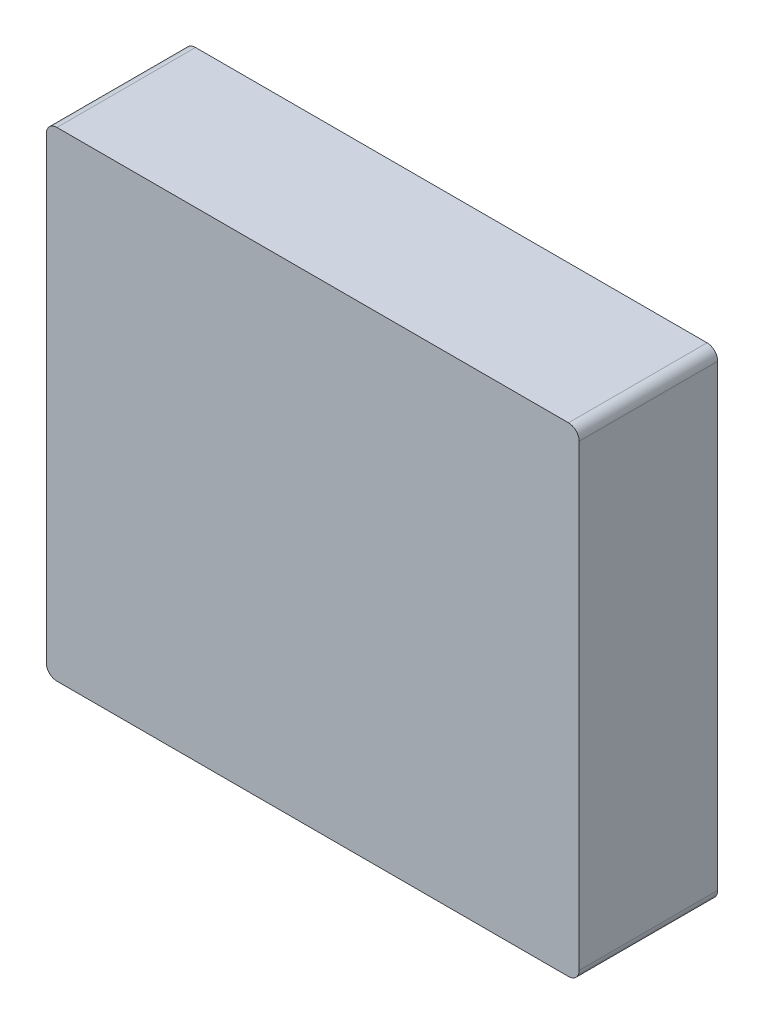
ISO-10303-21;
HEADER;
FILE_DESCRIPTION(('STEP AP214'),'2;1');
FILE_NAME('part.step','',(''),(''),'','','');
FILE_SCHEMA(('AUTOMOTIVE_DESIGN { 1 0 10303 214 1 1 1 1 }'));
ENDSEC;
DATA;
#1=APPLICATION_CONTEXT('core data for automotive mechanical design processes');
#2=APPLICATION_PROTOCOL_DEFINITION('international standard','automotive_design',2000,#1);
#3=PRODUCT_CONTEXT('',#1,'mechanical');
#4=PRODUCT('Part','Part','',(#3));
#5=PRODUCT_RELATED_PRODUCT_CATEGORY('part','',(#4));
#6=PRODUCT_DEFINITION_FORMATION('','',#4);
#7=PRODUCT_DEFINITION_CONTEXT('part definition',#1,'design');
#8=PRODUCT_DEFINITION('design','',#6,#7);
#9=PRODUCT_DEFINITION_SHAPE('','',#8);
#10=(LENGTH_UNIT() NAMED_UNIT(*) SI_UNIT(.MILLI.,.METRE.));
#11=(NAMED_UNIT(*) PLANE_ANGLE_UNIT() SI_UNIT($,.RADIAN.));
#12=(NAMED_UNIT(*) SI_UNIT($,.STERADIAN.) SOLID_ANGLE_UNIT());
#13=UNCERTAINTY_MEASURE_WITH_UNIT(LENGTH_MEASURE(1.E-05),#10,'distance_accuracy_value','');
#14=(GEOMETRIC_REPRESENTATION_CONTEXT(3) GLOBAL_UNCERTAINTY_ASSIGNED_CONTEXT((#13)) GLOBAL_UNIT_ASSIGNED_CONTEXT((#10,
#11,#12)) REPRESENTATION_CONTEXT('',''));
#15=CARTESIAN_POINT('',(0.,0.,0.));
#16=DIRECTION('',(0.,0.,1.));
#17=DIRECTION('',(1.,0.,0.));
#18=AXIS2_PLACEMENT_3D('',#15,#16,#17);
#19=CARTESIAN_POINT('',(-48.,-43.,26.));
#20=DIRECTION('',(0.,0.,-1.));
#21=DIRECTION('',(-1.,0.,0.));
#22=AXIS2_PLACEMENT_3D('',#19,#20,#21);
#23=CYLINDRICAL_SURFACE('',#22,2.);
#24=CARTESIAN_POINT('',(-48.,-43.,0.));
#25=DIRECTION('',(0.,0.,1.));
#26=DIRECTION('',(1.,0.,0.));
#27=AXIS2_PLACEMENT_3D('',#24,#25,#26);
#28=CIRCLE('',#27,2.);
#29=CARTESIAN_POINT('',(-50.,-43.,0.));
#30=VERTEX_POINT('',#29);
#31=CARTESIAN_POINT('',(-48.,-45.,0.));
#32=VERTEX_POINT('',#31);
#33=EDGE_CURVE('E173',#30,#32,#28,.T.);
#34=ORIENTED_EDGE('',*,*,#33,.T.);
#35=DIRECTION('',(0.,0.,-1.));
#36=VECTOR('',#35,1.);
#37=CARTESIAN_POINT('',(-48.,-45.,26.));
#38=LINE('',#37,#36);
#39=CARTESIAN_POINT('',(-48.,-45.,26.));
#40=VERTEX_POINT('',#39);
#41=EDGE_CURVE('E154',#40,#32,#38,.T.);
#42=ORIENTED_EDGE('',*,*,#41,.F.);
#43=CARTESIAN_POINT('',(-48.,-43.,26.));
#44=DIRECTION('',(0.,0.,1.));
#45=DIRECTION('',(1.,0.,0.));
#46=AXIS2_PLACEMENT_3D('',#43,#44,#45);
#47=CIRCLE('',#46,2.);
#48=CARTESIAN_POINT('',(-50.,-43.,26.));
#49=VERTEX_POINT('',#48);
#50=EDGE_CURVE('E161',#49,#40,#47,.T.);
#51=ORIENTED_EDGE('',*,*,#50,.F.);
#52=DIRECTION('',(0.,0.,-1.));
#53=VECTOR('',#52,1.);
#54=CARTESIAN_POINT('',(-50.,-43.,26.));
#55=LINE('',#54,#53);
#56=EDGE_CURVE('E275',#49,#30,#55,.T.);
#57=ORIENTED_EDGE('',*,*,#56,.T.);
#58=EDGE_LOOP('',(#34,#42,#51,#57));
#59=FACE_BOUND('',#58,.T.);
#60=ADVANCED_FACE('F34',(#59),#23,.T.);
#61=CARTESIAN_POINT('',(-48.,-45.,26.));
#62=DIRECTION('',(0.,1.,0.));
#63=DIRECTION('',(-1.,0.,0.));
#64=AXIS2_PLACEMENT_3D('',#61,#62,#63);
#65=PLANE('',#64);
#66=DIRECTION('',(1.,0.,0.));
#67=VECTOR('',#66,1.);
#68=CARTESIAN_POINT('',(-48.,-45.,0.));
#69=LINE('',#68,#67);
#70=CARTESIAN_POINT('',(48.,-45.,0.));
#71=VERTEX_POINT('',#70);
#72=EDGE_CURVE('E259',#32,#71,#69,.T.);
#73=ORIENTED_EDGE('',*,*,#72,.T.);
#74=DIRECTION('',(0.,0.,-1.));
#75=VECTOR('',#74,1.);
#76=CARTESIAN_POINT('',(48.,-45.,26.));
#77=LINE('',#76,#75);
#78=CARTESIAN_POINT('',(48.,-45.,26.));
#79=VERTEX_POINT('',#78);
#80=EDGE_CURVE('E157',#79,#71,#77,.T.);
#81=ORIENTED_EDGE('',*,*,#80,.F.);
#82=DIRECTION('',(1.,0.,0.));
#83=VECTOR('',#82,1.);
#84=CARTESIAN_POINT('',(-48.,-45.,26.));
#85=LINE('',#84,#83);
#86=EDGE_CURVE('E150',#40,#79,#85,.T.);
#87=ORIENTED_EDGE('',*,*,#86,.F.);
#88=ORIENTED_EDGE('',*,*,#41,.T.);
#89=EDGE_LOOP('',(#73,#81,#87,#88));
#90=FACE_BOUND('',#89,.T.);
#91=ADVANCED_FACE('F152',(#90),#65,.F.);
#92=CARTESIAN_POINT('',(48.,-43.,26.));
#93=DIRECTION('',(0.,0.,-1.));
#94=DIRECTION('',(-1.,0.,0.));
#95=AXIS2_PLACEMENT_3D('',#92,#93,#94);
#96=CYLINDRICAL_SURFACE('',#95,2.);
#97=CARTESIAN_POINT('',(48.,-43.,0.));
#98=DIRECTION('',(0.,0.,1.));
#99=DIRECTION('',(1.,0.,0.));
#100=AXIS2_PLACEMENT_3D('',#97,#98,#99);
#101=CIRCLE('',#100,2.);
#102=CARTESIAN_POINT('',(50.,-43.,0.));
#103=VERTEX_POINT('',#102);
#104=EDGE_CURVE('E278',#71,#103,#101,.T.);
#105=ORIENTED_EDGE('',*,*,#104,.T.);
#106=DIRECTION('',(0.,0.,-1.));
#107=VECTOR('',#106,1.);
#108=CARTESIAN_POINT('',(50.,-43.,26.));
#109=LINE('',#108,#107);
#110=CARTESIAN_POINT('',(50.,-43.,26.));
#111=VERTEX_POINT('',#110);
#112=EDGE_CURVE('E178',#111,#103,#109,.T.);
#113=ORIENTED_EDGE('',*,*,#112,.F.);
#114=CARTESIAN_POINT('',(48.,-43.,26.));
#115=DIRECTION('',(0.,0.,1.));
#116=DIRECTION('',(1.,0.,0.));
#117=AXIS2_PLACEMENT_3D('',#114,#115,#116);
#118=CIRCLE('',#117,2.);
#119=EDGE_CURVE('E160',#79,#111,#118,.T.);
#120=ORIENTED_EDGE('',*,*,#119,.F.);
#121=ORIENTED_EDGE('',*,*,#80,.T.);
#122=EDGE_LOOP('',(#105,#113,#120,#121));
#123=FACE_BOUND('',#122,.T.);
#124=ADVANCED_FACE('F323',(#123),#96,.T.);
#125=CARTESIAN_POINT('',(50.,-43.,26.));
#126=DIRECTION('',(-1.,0.,0.));
#127=DIRECTION('',(0.,-1.,0.));
#128=AXIS2_PLACEMENT_3D('',#125,#126,#127);
#129=PLANE('',#128);
#130=DIRECTION('',(0.,1.,0.));
#131=VECTOR('',#130,1.);
#132=CARTESIAN_POINT('',(50.,-43.,0.));
#133=LINE('',#132,#131);
#134=CARTESIAN_POINT('',(50.,43.,0.));
#135=VERTEX_POINT('',#134);
#136=EDGE_CURVE('E280',#103,#135,#133,.T.);
#137=ORIENTED_EDGE('',*,*,#136,.T.);
#138=DIRECTION('',(0.,0.,-1.));
#139=VECTOR('',#138,1.);
#140=CARTESIAN_POINT('',(50.,43.,26.));
#141=LINE('',#140,#139);
#142=CARTESIAN_POINT('',(50.,43.,26.));
#143=VERTEX_POINT('',#142);
#144=EDGE_CURVE('E299',#143,#135,#141,.T.);
#145=ORIENTED_EDGE('',*,*,#144,.F.);
#146=DIRECTION('',(0.,1.,0.));
#147=VECTOR('',#146,1.);
#148=CARTESIAN_POINT('',(50.,-43.,26.));
#149=LINE('',#148,#147);
#150=EDGE_CURVE('E267',#111,#143,#149,.T.);
#151=ORIENTED_EDGE('',*,*,#150,.F.);
#152=ORIENTED_EDGE('',*,*,#112,.T.);
#153=EDGE_LOOP('',(#137,#145,#151,#152));
#154=FACE_BOUND('',#153,.T.);
#155=ADVANCED_FACE('F306',(#154),#129,.F.);
#156=CARTESIAN_POINT('',(48.,43.,26.));
#157=DIRECTION('',(0.,0.,-1.));
#158=DIRECTION('',(-1.,0.,0.));
#159=AXIS2_PLACEMENT_3D('',#156,#157,#158);
#160=CYLINDRICAL_SURFACE('',#159,2.);
#161=CARTESIAN_POINT('',(48.,43.,0.));
#162=DIRECTION('',(0.,0.,1.));
#163=DIRECTION('',(1.,0.,0.));
#164=AXIS2_PLACEMENT_3D('',#161,#162,#163);
#165=CIRCLE('',#164,2.);
#166=CARTESIAN_POINT('',(48.,45.,0.));
#167=VERTEX_POINT('',#166);
#168=EDGE_CURVE('E282',#135,#167,#165,.T.);
#169=ORIENTED_EDGE('',*,*,#168,.T.);
#170=DIRECTION('',(0.,0.,-1.));
#171=VECTOR('',#170,1.);
#172=CARTESIAN_POINT('',(48.,45.,26.));
#173=LINE('',#172,#171);
#174=CARTESIAN_POINT('',(48.,45.,26.));
#175=VERTEX_POINT('',#174);
#176=EDGE_CURVE('E296',#175,#167,#173,.T.);
#177=ORIENTED_EDGE('',*,*,#176,.F.);
#178=CARTESIAN_POINT('',(48.,43.,26.));
#179=DIRECTION('',(0.,0.,1.));
#180=DIRECTION('',(1.,0.,0.));
#181=AXIS2_PLACEMENT_3D('',#178,#179,#180);
#182=CIRCLE('',#181,2.);
#183=EDGE_CURVE('E269',#143,#175,#182,.T.);
#184=ORIENTED_EDGE('',*,*,#183,.F.);
#185=ORIENTED_EDGE('',*,*,#144,.T.);
#186=EDGE_LOOP('',(#169,#177,#184,#185));
#187=FACE_BOUND('',#186,.T.);
#188=ADVANCED_FACE('F315',(#187),#160,.T.);
#189=CARTESIAN_POINT('',(48.,45.,26.));
#190=DIRECTION('',(0.,-1.,0.));
#191=DIRECTION('',(1.,0.,0.));
#192=AXIS2_PLACEMENT_3D('',#189,#190,#191);
#193=PLANE('',#192);
#194=DIRECTION('',(-1.,0.,0.));
#195=VECTOR('',#194,1.);
#196=CARTESIAN_POINT('',(48.,45.,0.));
#197=LINE('',#196,#195);
#198=CARTESIAN_POINT('',(-48.,45.,0.));
#199=VERTEX_POINT('',#198);
#200=EDGE_CURVE('E284',#167,#199,#197,.T.);
#201=ORIENTED_EDGE('',*,*,#200,.T.);
#202=DIRECTION('',(0.,0.,-1.));
#203=VECTOR('',#202,1.);
#204=CARTESIAN_POINT('',(-48.,45.,26.));
#205=LINE('',#204,#203);
#206=CARTESIAN_POINT('',(-48.,45.,26.));
#207=VERTEX_POINT('',#206);
#208=EDGE_CURVE('E293',#207,#199,#205,.T.);
#209=ORIENTED_EDGE('',*,*,#208,.F.);
#210=DIRECTION('',(-1.,0.,0.));
#211=VECTOR('',#210,1.);
#212=CARTESIAN_POINT('',(48.,45.,26.));
#213=LINE('',#212,#211);
#214=EDGE_CURVE('E271',#175,#207,#213,.T.);
#215=ORIENTED_EDGE('',*,*,#214,.F.);
#216=ORIENTED_EDGE('',*,*,#176,.T.);
#217=EDGE_LOOP('',(#201,#209,#215,#216));
#218=FACE_BOUND('',#217,.T.);
#219=ADVANCED_FACE('F319',(#218),#193,.F.);
#220=CARTESIAN_POINT('',(-48.,43.,26.));
#221=DIRECTION('',(0.,0.,-1.));
#222=DIRECTION('',(-1.,0.,0.));
#223=AXIS2_PLACEMENT_3D('',#220,#221,#222);
#224=CYLINDRICAL_SURFACE('',#223,2.);
#225=CARTESIAN_POINT('',(-48.,43.,0.));
#226=DIRECTION('',(0.,0.,1.));
#227=DIRECTION('',(1.,0.,0.));
#228=AXIS2_PLACEMENT_3D('',#225,#226,#227);
#229=CIRCLE('',#228,2.);
#230=CARTESIAN_POINT('',(-50.,43.,0.));
#231=VERTEX_POINT('',#230);
#232=EDGE_CURVE('E286',#199,#231,#229,.T.);
#233=ORIENTED_EDGE('',*,*,#232,.T.);
#234=DIRECTION('',(0.,0.,-1.));
#235=VECTOR('',#234,1.);
#236=CARTESIAN_POINT('',(-50.,43.,26.));
#237=LINE('',#236,#235);
#238=CARTESIAN_POINT('',(-50.,43.,26.));
#239=VERTEX_POINT('',#238);
#240=EDGE_CURVE('E290',#239,#231,#237,.T.);
#241=ORIENTED_EDGE('',*,*,#240,.F.);
#242=CARTESIAN_POINT('',(-48.,43.,26.));
#243=DIRECTION('',(0.,0.,1.));
#244=DIRECTION('',(1.,0.,0.));
#245=AXIS2_PLACEMENT_3D('',#242,#243,#244);
#246=CIRCLE('',#245,2.);
#247=EDGE_CURVE('E273',#207,#239,#246,.T.);
#248=ORIENTED_EDGE('',*,*,#247,.F.);
#249=ORIENTED_EDGE('',*,*,#208,.T.);
#250=EDGE_LOOP('',(#233,#241,#248,#249));
#251=FACE_BOUND('',#250,.T.);
#252=ADVANCED_FACE('F443',(#251),#224,.T.);
#253=CARTESIAN_POINT('',(-50.,43.,26.));
#254=DIRECTION('',(1.,0.,0.));
#255=DIRECTION('',(0.,1.,0.));
#256=AXIS2_PLACEMENT_3D('',#253,#254,#255);
#257=PLANE('',#256);
#258=DIRECTION('',(0.,-1.,0.));
#259=VECTOR('',#258,1.);
#260=CARTESIAN_POINT('',(-50.,43.,0.));
#261=LINE('',#260,#259);
#262=EDGE_CURVE('E170',#231,#30,#261,.T.);
#263=ORIENTED_EDGE('',*,*,#262,.T.);
#264=ORIENTED_EDGE('',*,*,#56,.F.);
#265=DIRECTION('',(0.,-1.,0.));
#266=VECTOR('',#265,1.);
#267=CARTESIAN_POINT('',(-50.,43.,26.));
#268=LINE('',#267,#266);
#269=EDGE_CURVE('E166',#239,#49,#268,.T.);
#270=ORIENTED_EDGE('',*,*,#269,.F.);
#271=ORIENTED_EDGE('',*,*,#240,.T.);
#272=EDGE_LOOP('',(#263,#264,#270,#271));
#273=FACE_BOUND('',#272,.T.);
#274=ADVANCED_FACE('F437',(#273),#257,.F.);
#275=CARTESIAN_POINT('',(-48.,-43.,26.));
#276=DIRECTION('',(0.,0.,1.));
#277=DIRECTION('',(1.,0.,0.));
#278=AXIS2_PLACEMENT_3D('',#275,#276,#277);
#279=PLANE('',#278);
#280=ORIENTED_EDGE('',*,*,#50,.T.);
#281=ORIENTED_EDGE('',*,*,#86,.T.);
#282=ORIENTED_EDGE('',*,*,#119,.T.);
#283=ORIENTED_EDGE('',*,*,#150,.T.);
#284=ORIENTED_EDGE('',*,*,#183,.T.);
#285=ORIENTED_EDGE('',*,*,#214,.T.);
#286=ORIENTED_EDGE('',*,*,#247,.T.);
#287=ORIENTED_EDGE('',*,*,#269,.T.);
#288=EDGE_LOOP('',(#280,#281,#282,#283,#284,#285,#286,#287));
#289=FACE_BOUND('',#288,.T.);
#290=ADVANCED_FACE('F164',(#289),#279,.T.);
#291=CARTESIAN_POINT('',(-48.,-43.,0.));
#292=DIRECTION('',(0.,0.,1.));
#293=DIRECTION('',(1.,0.,0.));
#294=AXIS2_PLACEMENT_3D('',#291,#292,#293);
#295=PLANE('',#294);
#296=DIRECTION('',(0.,-1.,0.));
#297=VECTOR('',#296,1.);
#298=CARTESIAN_POINT('',(48.5,-43.,0.));
#299=LINE('',#298,#297);
#300=CARTESIAN_POINT('',(48.5,-43.5,0.));
#301=VERTEX_POINT('',#300);
#302=CARTESIAN_POINT('',(48.5,43.5,0.));
#303=VERTEX_POINT('',#302);
#304=EDGE_CURVE('E215',#301,#303,#299,.F.);
#305=ORIENTED_EDGE('',*,*,#304,.T.);
#306=DIRECTION('',(1.,0.,0.));
#307=VECTOR('',#306,1.);
#308=CARTESIAN_POINT('',(-48.,43.5,0.));
#309=LINE('',#308,#307);
#310=CARTESIAN_POINT('',(-48.5,43.5,0.));
#311=VERTEX_POINT('',#310);
#312=EDGE_CURVE('E217',#303,#311,#309,.F.);
#313=ORIENTED_EDGE('',*,*,#312,.T.);
#314=DIRECTION('',(0.,1.,0.));
#315=VECTOR('',#314,1.);
#316=CARTESIAN_POINT('',(-48.5,-43.,0.));
#317=LINE('',#316,#315);
#318=CARTESIAN_POINT('',(-48.5,-43.5,0.));
#319=VERTEX_POINT('',#318);
#320=EDGE_CURVE('E211',#311,#319,#317,.F.);
#321=ORIENTED_EDGE('',*,*,#320,.T.);
#322=DIRECTION('',(-1.,0.,0.));
#323=VECTOR('',#322,1.);
#324=CARTESIAN_POINT('',(-48.,-43.5,0.));
#325=LINE('',#324,#323);
#326=EDGE_CURVE('E213',#319,#301,#325,.F.);
#327=ORIENTED_EDGE('',*,*,#326,.T.);
#328=EDGE_LOOP('',(#305,#313,#321,#327));
#329=FACE_BOUND('',#328,.T.);
#330=ORIENTED_EDGE('',*,*,#33,.F.);
#331=ORIENTED_EDGE('',*,*,#262,.F.);
#332=ORIENTED_EDGE('',*,*,#232,.F.);
#333=ORIENTED_EDGE('',*,*,#200,.F.);
#334=ORIENTED_EDGE('',*,*,#168,.F.);
#335=ORIENTED_EDGE('',*,*,#136,.F.);
#336=ORIENTED_EDGE('',*,*,#104,.F.);
#337=ORIENTED_EDGE('',*,*,#72,.F.);
#338=EDGE_LOOP('',(#330,#331,#332,#333,#334,#335,#336,#337));
#339=FACE_BOUND('',#338,.T.);
#340=ADVANCED_FACE('F240',(#329,#339),#295,.F.);
#341=CARTESIAN_POINT('',(48.,43.,23.));
#342=DIRECTION('',(1.,0.,0.));
#343=DIRECTION('',(0.,1.,0.));
#344=AXIS2_PLACEMENT_3D('',#341,#342,#343);
#345=PLANE('',#344);
#346=DIRECTION('',(0.,0.,-1.));
#347=VECTOR('',#346,1.);
#348=CARTESIAN_POINT('',(48.,43.,23.));
#349=LINE('',#348,#347);
#350=CARTESIAN_POINT('',(48.,43.,22.));
#351=VERTEX_POINT('',#350);
#352=CARTESIAN_POINT('',(48.,43.,0.5));
#353=VERTEX_POINT('',#352);
#354=EDGE_CURVE('E252',#351,#353,#349,.T.);
#355=ORIENTED_EDGE('',*,*,#354,.T.);
#356=DIRECTION('',(0.,-1.,0.));
#357=VECTOR('',#356,1.);
#358=CARTESIAN_POINT('',(48.,43.,0.5));
#359=LINE('',#358,#357);
#360=CARTESIAN_POINT('',(48.,-43.,0.5));
#361=VERTEX_POINT('',#360);
#362=EDGE_CURVE('E58',#353,#361,#359,.T.);
#363=ORIENTED_EDGE('',*,*,#362,.T.);
#364=DIRECTION('',(0.,0.,-1.));
#365=VECTOR('',#364,1.);
#366=CARTESIAN_POINT('',(48.,-43.,23.));
#367=LINE('',#366,#365);
#368=CARTESIAN_POINT('',(48.,-43.,22.));
#369=VERTEX_POINT('',#368);
#370=EDGE_CURVE('E208',#369,#361,#367,.T.);
#371=ORIENTED_EDGE('',*,*,#370,.F.);
#372=DIRECTION('',(0.,-1.,0.));
#373=VECTOR('',#372,1.);
#374=CARTESIAN_POINT('',(48.,43.,22.));
#375=LINE('',#374,#373);
#376=EDGE_CURVE('E195',#369,#351,#375,.F.);
#377=ORIENTED_EDGE('',*,*,#376,.T.);
#378=EDGE_LOOP('',(#355,#363,#371,#377));
#379=FACE_BOUND('',#378,.T.);
#380=ADVANCED_FACE('F256',(#379),#345,.F.);
#381=CARTESIAN_POINT('',(-48.,43.,23.));
#382=DIRECTION('',(0.,1.,0.));
#383=DIRECTION('',(-1.,0.,0.));
#384=AXIS2_PLACEMENT_3D('',#381,#382,#383);
#385=PLANE('',#384);
#386=DIRECTION('',(0.,0.,-1.));
#387=VECTOR('',#386,1.);
#388=CARTESIAN_POINT('',(-48.,43.,23.));
#389=LINE('',#388,#387);
#390=CARTESIAN_POINT('',(-48.,43.,22.));
#391=VERTEX_POINT('',#390);
#392=CARTESIAN_POINT('',(-48.,43.,0.5));
#393=VERTEX_POINT('',#392);
#394=EDGE_CURVE('E255',#391,#393,#389,.T.);
#395=ORIENTED_EDGE('',*,*,#394,.T.);
#396=DIRECTION('',(1.,0.,0.));
#397=VECTOR('',#396,1.);
#398=CARTESIAN_POINT('',(-48.,43.,0.5));
#399=LINE('',#398,#397);
#400=EDGE_CURVE('E197',#393,#353,#399,.T.);
#401=ORIENTED_EDGE('',*,*,#400,.T.);
#402=ORIENTED_EDGE('',*,*,#354,.F.);
#403=DIRECTION('',(1.,0.,0.));
#404=VECTOR('',#403,1.);
#405=CARTESIAN_POINT('',(-48.,43.,22.));
#406=LINE('',#405,#404);
#407=EDGE_CURVE('E188',#351,#391,#406,.F.);
#408=ORIENTED_EDGE('',*,*,#407,.T.);
#409=EDGE_LOOP('',(#395,#401,#402,#408));
#410=FACE_BOUND('',#409,.T.);
#411=ADVANCED_FACE('F251',(#410),#385,.F.);
#412=CARTESIAN_POINT('',(-48.,-43.,23.));
#413=DIRECTION('',(-1.,0.,0.));
#414=DIRECTION('',(0.,-1.,0.));
#415=AXIS2_PLACEMENT_3D('',#412,#413,#414);
#416=PLANE('',#415);
#417=DIRECTION('',(0.,0.,-1.));
#418=VECTOR('',#417,1.);
#419=CARTESIAN_POINT('',(-48.,-43.,23.));
#420=LINE('',#419,#418);
#421=CARTESIAN_POINT('',(-48.,-43.,22.));
#422=VERTEX_POINT('',#421);
#423=CARTESIAN_POINT('',(-48.,-43.,0.5));
#424=VERTEX_POINT('',#423);
#425=EDGE_CURVE('E261',#422,#424,#420,.T.);
#426=ORIENTED_EDGE('',*,*,#425,.T.);
#427=DIRECTION('',(0.,1.,0.));
#428=VECTOR('',#427,1.);
#429=CARTESIAN_POINT('',(-48.,-43.,0.5));
#430=LINE('',#429,#428);
#431=EDGE_CURVE('E11',#424,#393,#430,.T.);
#432=ORIENTED_EDGE('',*,*,#431,.T.);
#433=ORIENTED_EDGE('',*,*,#394,.F.);
#434=DIRECTION('',(0.,1.,0.));
#435=VECTOR('',#434,1.);
#436=CARTESIAN_POINT('',(-48.,-43.,22.));
#437=LINE('',#436,#435);
#438=EDGE_CURVE('E191',#391,#422,#437,.F.);
#439=ORIENTED_EDGE('',*,*,#438,.T.);
#440=EDGE_LOOP('',(#426,#432,#433,#439));
#441=FACE_BOUND('',#440,.T.);
#442=ADVANCED_FACE('F396',(#441),#416,.F.);
#443=CARTESIAN_POINT('',(48.,-43.,23.));
#444=DIRECTION('',(0.,-1.,0.));
#445=DIRECTION('',(1.,0.,0.));
#446=AXIS2_PLACEMENT_3D('',#443,#444,#445);
#447=PLANE('',#446);
#448=ORIENTED_EDGE('',*,*,#370,.T.);
#449=DIRECTION('',(-1.,0.,0.));
#450=VECTOR('',#449,1.);
#451=CARTESIAN_POINT('',(48.,-43.,0.5));
#452=LINE('',#451,#450);
#453=EDGE_CURVE('E43',#361,#424,#452,.T.);
#454=ORIENTED_EDGE('',*,*,#453,.T.);
#455=ORIENTED_EDGE('',*,*,#425,.F.);
#456=DIRECTION('',(-1.,0.,0.));
#457=VECTOR('',#456,1.);
#458=CARTESIAN_POINT('',(48.,-43.,22.));
#459=LINE('',#458,#457);
#460=EDGE_CURVE('E193',#422,#369,#459,.F.);
#461=ORIENTED_EDGE('',*,*,#460,.T.);
#462=EDGE_LOOP('',(#448,#454,#455,#461));
#463=FACE_BOUND('',#462,.T.);
#464=ADVANCED_FACE('F387',(#463),#447,.F.);
#465=CARTESIAN_POINT('',(0.,0.,23.));
#466=DIRECTION('',(0.,0.,1.));
#467=DIRECTION('',(1.,0.,0.));
#468=AXIS2_PLACEMENT_3D('',#465,#466,#467);
#469=PLANE('',#468);
#470=DIRECTION('',(0.,1.,0.));
#471=VECTOR('',#470,1.);
#472=CARTESIAN_POINT('',(-47.,43.,23.));
#473=LINE('',#472,#471);
#474=CARTESIAN_POINT('',(-47.,-42.,23.));
#475=VERTEX_POINT('',#474);
#476=CARTESIAN_POINT('',(-47.,42.,23.));
#477=VERTEX_POINT('',#476);
#478=EDGE_CURVE('E183',#475,#477,#473,.T.);
#479=ORIENTED_EDGE('',*,*,#478,.T.);
#480=DIRECTION('',(1.,0.,0.));
#481=VECTOR('',#480,1.);
#482=CARTESIAN_POINT('',(48.,42.,23.));
#483=LINE('',#482,#481);
#484=CARTESIAN_POINT('',(47.,42.,23.));
#485=VERTEX_POINT('',#484);
#486=EDGE_CURVE('E185',#477,#485,#483,.T.);
#487=ORIENTED_EDGE('',*,*,#486,.T.);
#488=DIRECTION('',(0.,-1.,0.));
#489=VECTOR('',#488,1.);
#490=CARTESIAN_POINT('',(47.,-43.,23.));
#491=LINE('',#490,#489);
#492=CARTESIAN_POINT('',(47.,-42.,23.));
#493=VERTEX_POINT('',#492);
#494=EDGE_CURVE('E174',#485,#493,#491,.T.);
#495=ORIENTED_EDGE('',*,*,#494,.T.);
#496=DIRECTION('',(-1.,0.,0.));
#497=VECTOR('',#496,1.);
#498=CARTESIAN_POINT('',(-48.,-42.,23.));
#499=LINE('',#498,#497);
#500=EDGE_CURVE('E176',#493,#475,#499,.T.);
#501=ORIENTED_EDGE('',*,*,#500,.T.);
#502=EDGE_LOOP('',(#479,#487,#495,#501));
#503=FACE_BOUND('',#502,.T.);
#504=ADVANCED_FACE('F352',(#503),#469,.F.);
#505=CARTESIAN_POINT('',(0.,-42.,22.));
#506=DIRECTION('',(1.,0.,0.));
#507=DIRECTION('',(0.,1.,0.));
#508=AXIS2_PLACEMENT_3D('',#505,#506,#507);
#509=CYLINDRICAL_SURFACE('',#508,1.);
#510=CARTESIAN_POINT('',(47.,-42.,22.));
#511=DIRECTION('',(0.707106781186548,0.707106781186547,0.));
#512=DIRECTION('',(0.707106781186547,-0.707106781186548,0.));
#513=AXIS2_PLACEMENT_3D('',#510,#511,#512);
#514=ELLIPSE('',#513,1.4142135623731,1.);
#515=EDGE_CURVE('E202',#369,#493,#514,.F.);
#516=ORIENTED_EDGE('',*,*,#515,.F.);
#517=ORIENTED_EDGE('',*,*,#460,.F.);
#518=CARTESIAN_POINT('',(-47.,-42.,22.));
#519=DIRECTION('',(0.707106781186547,-0.707106781186548,0.));
#520=DIRECTION('',(-0.707106781186548,-0.707106781186547,0.));
#521=AXIS2_PLACEMENT_3D('',#518,#519,#520);
#522=ELLIPSE('',#521,1.41421356237309,1.);
#523=EDGE_CURVE('E205',#475,#422,#522,.T.);
#524=ORIENTED_EDGE('',*,*,#523,.F.);
#525=ORIENTED_EDGE('',*,*,#500,.F.);
#526=EDGE_LOOP('',(#516,#517,#524,#525));
#527=FACE_BOUND('',#526,.T.);
#528=ADVANCED_FACE('F348',(#527),#509,.F.);
#529=CARTESIAN_POINT('',(-47.,0.,22.));
#530=DIRECTION('',(0.,-1.,0.));
#531=DIRECTION('',(1.,0.,0.));
#532=AXIS2_PLACEMENT_3D('',#529,#530,#531);
#533=CYLINDRICAL_SURFACE('',#532,1.);
#534=ORIENTED_EDGE('',*,*,#523,.T.);
#535=ORIENTED_EDGE('',*,*,#438,.F.);
#536=CARTESIAN_POINT('',(-47.,42.,22.));
#537=DIRECTION('',(-0.707106781186548,-0.707106781186547,0.));
#538=DIRECTION('',(-0.707106781186547,0.707106781186548,0.));
#539=AXIS2_PLACEMENT_3D('',#536,#537,#538);
#540=ELLIPSE('',#539,1.41421356237309,1.);
#541=EDGE_CURVE('E200',#477,#391,#540,.T.);
#542=ORIENTED_EDGE('',*,*,#541,.F.);
#543=ORIENTED_EDGE('',*,*,#478,.F.);
#544=EDGE_LOOP('',(#534,#535,#542,#543));
#545=FACE_BOUND('',#544,.T.);
#546=ADVANCED_FACE('F344',(#545),#533,.F.);
#547=CARTESIAN_POINT('',(47.,0.,22.));
#548=DIRECTION('',(0.,1.,0.));
#549=DIRECTION('',(-1.,0.,0.));
#550=AXIS2_PLACEMENT_3D('',#547,#548,#549);
#551=CYLINDRICAL_SURFACE('',#550,1.);
#552=ORIENTED_EDGE('',*,*,#515,.T.);
#553=ORIENTED_EDGE('',*,*,#494,.F.);
#554=CARTESIAN_POINT('',(47.,42.,22.));
#555=DIRECTION('',(-0.707106781186547,0.707106781186548,0.));
#556=DIRECTION('',(-0.707106781186548,-0.707106781186547,0.));
#557=AXIS2_PLACEMENT_3D('',#554,#555,#556);
#558=ELLIPSE('',#557,1.41421356237309,1.);
#559=EDGE_CURVE('E198',#351,#485,#558,.F.);
#560=ORIENTED_EDGE('',*,*,#559,.F.);
#561=ORIENTED_EDGE('',*,*,#376,.F.);
#562=EDGE_LOOP('',(#552,#553,#560,#561));
#563=FACE_BOUND('',#562,.T.);
#564=ADVANCED_FACE('F340',(#563),#551,.F.);
#565=CARTESIAN_POINT('',(0.,42.,22.));
#566=DIRECTION('',(-1.,0.,0.));
#567=DIRECTION('',(0.,-1.,0.));
#568=AXIS2_PLACEMENT_3D('',#565,#566,#567);
#569=CYLINDRICAL_SURFACE('',#568,1.);
#570=ORIENTED_EDGE('',*,*,#541,.T.);
#571=ORIENTED_EDGE('',*,*,#407,.F.);
#572=ORIENTED_EDGE('',*,*,#559,.T.);
#573=ORIENTED_EDGE('',*,*,#486,.F.);
#574=EDGE_LOOP('',(#570,#571,#572,#573));
#575=FACE_BOUND('',#574,.T.);
#576=ADVANCED_FACE('F337',(#575),#569,.F.);
#577=CARTESIAN_POINT('',(48.,-43.5,0.5));
#578=DIRECTION('',(-1.,0.,0.));
#579=DIRECTION('',(0.,-1.,0.));
#580=AXIS2_PLACEMENT_3D('',#577,#578,#579);
#581=CYLINDRICAL_SURFACE('',#580,0.5);
#582=CARTESIAN_POINT('',(48.5,-43.5,0.5));
#583=DIRECTION('',(-0.707106781186548,-0.707106781186547,0.));
#584=DIRECTION('',(0.707106781186547,-0.707106781186548,0.));
#585=AXIS2_PLACEMENT_3D('',#582,#583,#584);
#586=ELLIPSE('',#585,0.707106781186548,0.5);
#587=EDGE_CURVE('E225',#301,#361,#586,.F.);
#588=ORIENTED_EDGE('',*,*,#587,.F.);
#589=ORIENTED_EDGE('',*,*,#326,.F.);
#590=CARTESIAN_POINT('',(-48.5,-43.5,0.5));
#591=DIRECTION('',(-0.707106781186547,0.707106781186548,0.));
#592=DIRECTION('',(-0.707106781186548,-0.707106781186547,0.));
#593=AXIS2_PLACEMENT_3D('',#590,#591,#592);
#594=ELLIPSE('',#593,0.707106781186547,0.5);
#595=EDGE_CURVE('E38',#424,#319,#594,.T.);
#596=ORIENTED_EDGE('',*,*,#595,.F.);
#597=ORIENTED_EDGE('',*,*,#453,.F.);
#598=EDGE_LOOP('',(#588,#589,#596,#597));
#599=FACE_BOUND('',#598,.T.);
#600=ADVANCED_FACE('F36',(#599),#581,.T.);
#601=CARTESIAN_POINT('',(-48.5,-43.,0.5));
#602=DIRECTION('',(0.,1.,0.));
#603=DIRECTION('',(-1.,0.,0.));
#604=AXIS2_PLACEMENT_3D('',#601,#602,#603);
#605=CYLINDRICAL_SURFACE('',#604,0.5);
#606=ORIENTED_EDGE('',*,*,#595,.T.);
#607=ORIENTED_EDGE('',*,*,#320,.F.);
#608=CARTESIAN_POINT('',(-48.5,43.5,0.5));
#609=DIRECTION('',(0.707106781186548,0.707106781186547,0.));
#610=DIRECTION('',(0.707106781186547,-0.707106781186548,0.));
#611=AXIS2_PLACEMENT_3D('',#608,#609,#610);
#612=ELLIPSE('',#611,0.707106781186547,0.5);
#613=EDGE_CURVE('E224',#393,#311,#612,.T.);
#614=ORIENTED_EDGE('',*,*,#613,.F.);
#615=ORIENTED_EDGE('',*,*,#431,.F.);
#616=EDGE_LOOP('',(#606,#607,#614,#615));
#617=FACE_BOUND('',#616,.T.);
#618=ADVANCED_FACE('F235',(#617),#605,.T.);
#619=CARTESIAN_POINT('',(48.5,43.,0.5));
#620=DIRECTION('',(0.,-1.,0.));
#621=DIRECTION('',(1.,0.,0.));
#622=AXIS2_PLACEMENT_3D('',#619,#620,#621);
#623=CYLINDRICAL_SURFACE('',#622,0.5);
#624=ORIENTED_EDGE('',*,*,#587,.T.);
#625=ORIENTED_EDGE('',*,*,#362,.F.);
#626=CARTESIAN_POINT('',(48.5,43.5,0.5));
#627=DIRECTION('',(0.707106781186547,-0.707106781186548,0.));
#628=DIRECTION('',(0.707106781186548,0.707106781186547,0.));
#629=AXIS2_PLACEMENT_3D('',#626,#627,#628);
#630=ELLIPSE('',#629,0.707106781186547,0.5);
#631=EDGE_CURVE('E222',#303,#353,#630,.F.);
#632=ORIENTED_EDGE('',*,*,#631,.F.);
#633=ORIENTED_EDGE('',*,*,#304,.F.);
#634=EDGE_LOOP('',(#624,#625,#632,#633));
#635=FACE_BOUND('',#634,.T.);
#636=ADVANCED_FACE('F247',(#635),#623,.T.);
#637=CARTESIAN_POINT('',(-48.,43.5,0.5));
#638=DIRECTION('',(1.,0.,0.));
#639=DIRECTION('',(0.,1.,0.));
#640=AXIS2_PLACEMENT_3D('',#637,#638,#639);
#641=CYLINDRICAL_SURFACE('',#640,0.5);
#642=ORIENTED_EDGE('',*,*,#613,.T.);
#643=ORIENTED_EDGE('',*,*,#312,.F.);
#644=ORIENTED_EDGE('',*,*,#631,.T.);
#645=ORIENTED_EDGE('',*,*,#400,.F.);
#646=EDGE_LOOP('',(#642,#643,#644,#645));
#647=FACE_BOUND('',#646,.T.);
#648=ADVANCED_FACE('F245',(#647),#641,.T.);
#649=CLOSED_SHELL('',(#60,#91,#124,#155,#188,#219,#252,#274,#290,#340,#380,#411,#442,#464,#504,
#528,#546,#564,#576,#600,#618,#636,#648));
#650=MANIFOLD_SOLID_BREP('B2',#649);
#651=ADVANCED_BREP_SHAPE_REPRESENTATION('',(#18,#650),#14);
#652=SHAPE_DEFINITION_REPRESENTATION(#9,#651);
ENDSEC;
END-ISO-10303-21;
